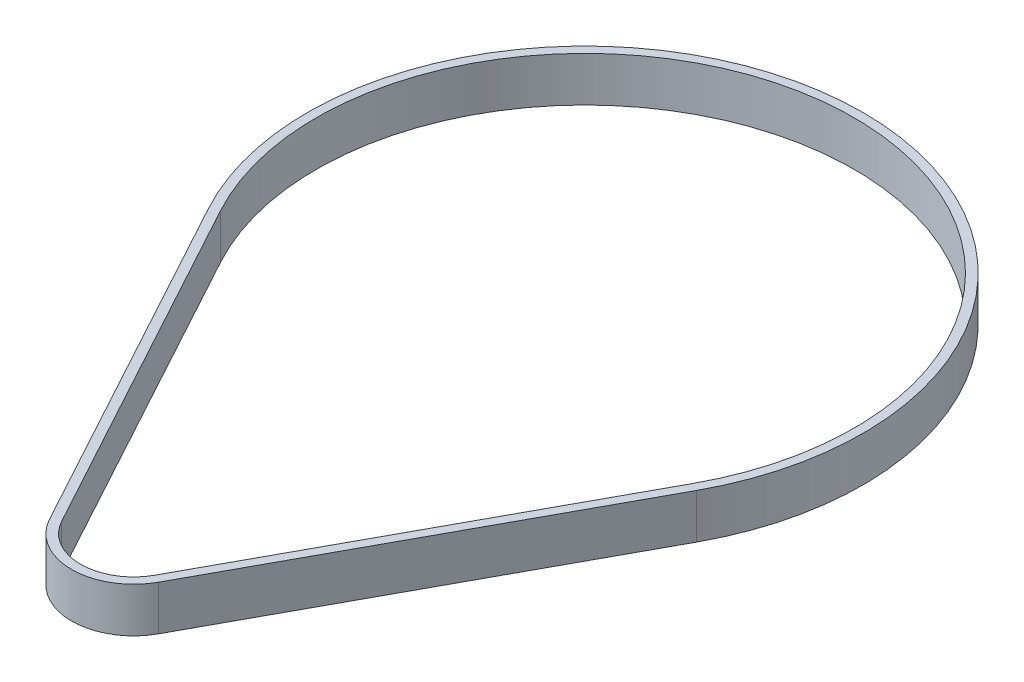
ISO-10303-21;
HEADER;
FILE_DESCRIPTION(('STEP AP214'),'2;1');
FILE_NAME('part.step','',(''),(''),'','','');
FILE_SCHEMA(('AUTOMOTIVE_DESIGN { 1 0 10303 214 1 1 1 1 }'));
ENDSEC;
DATA;
#1=APPLICATION_CONTEXT('core data for automotive mechanical design processes');
#2=APPLICATION_PROTOCOL_DEFINITION('international standard','automotive_design',2000,#1);
#3=PRODUCT_CONTEXT('',#1,'mechanical');
#4=PRODUCT('Part','Part','',(#3));
#5=PRODUCT_RELATED_PRODUCT_CATEGORY('part','',(#4));
#6=PRODUCT_DEFINITION_FORMATION('','',#4);
#7=PRODUCT_DEFINITION_CONTEXT('part definition',#1,'design');
#8=PRODUCT_DEFINITION('design','',#6,#7);
#9=PRODUCT_DEFINITION_SHAPE('','',#8);
#10=(LENGTH_UNIT() NAMED_UNIT(*) SI_UNIT(.MILLI.,.METRE.));
#11=(NAMED_UNIT(*) PLANE_ANGLE_UNIT() SI_UNIT($,.RADIAN.));
#12=(NAMED_UNIT(*) SI_UNIT($,.STERADIAN.) SOLID_ANGLE_UNIT());
#13=UNCERTAINTY_MEASURE_WITH_UNIT(LENGTH_MEASURE(1.E-05),#10,'distance_accuracy_value','');
#14=(GEOMETRIC_REPRESENTATION_CONTEXT(3) GLOBAL_UNCERTAINTY_ASSIGNED_CONTEXT((#13)) GLOBAL_UNIT_ASSIGNED_CONTEXT((#10,
#11,#12)) REPRESENTATION_CONTEXT('',''));
#15=CARTESIAN_POINT('',(0.,0.,0.));
#16=DIRECTION('',(0.,0.,1.));
#17=DIRECTION('',(1.,0.,0.));
#18=AXIS2_PLACEMENT_3D('',#15,#16,#17);
#19=CARTESIAN_POINT('',(12.1791391900727,10.,6.62622015849431));
#20=DIRECTION('',(-0.878408884967375,0.,-0.477909856364537));
#21=DIRECTION('',(-0.477909856364537,0.,0.878408884967375));
#22=AXIS2_PLACEMENT_3D('',#19,#20,#21);
#23=PLANE('',#22);
#24=DIRECTION('',(0.477909856364537,0.,-0.878408884967375));
#25=VECTOR('',#24,1.);
#26=CARTESIAN_POINT('',(12.1791391900727,0.,6.62622015849431));
#27=LINE('',#26,#25);
#28=CARTESIAN_POINT('',(12.1791391900727,0.,6.62622015849431));
#29=VERTEX_POINT('',#28);
#30=CARTESIAN_POINT('',(54.5579758453237,0.,-71.2670188211986));
#31=VERTEX_POINT('',#30);
#32=EDGE_CURVE('E145',#29,#31,#27,.T.);
#33=ORIENTED_EDGE('',*,*,#32,.T.);
#34=DIRECTION('',(0.,-1.,0.));
#35=VECTOR('',#34,1.);
#36=CARTESIAN_POINT('',(54.5579758453237,10.,-71.2670188211986));
#37=LINE('',#36,#35);
#38=CARTESIAN_POINT('',(54.5579758453237,10.,-71.2670188211986));
#39=VERTEX_POINT('',#38);
#40=EDGE_CURVE('E11',#39,#31,#37,.T.);
#41=ORIENTED_EDGE('',*,*,#40,.F.);
#42=DIRECTION('',(0.477909856364537,0.,-0.878408884967375));
#43=VECTOR('',#42,1.);
#44=CARTESIAN_POINT('',(12.1791391900727,10.,6.62622015849431));
#45=LINE('',#44,#43);
#46=CARTESIAN_POINT('',(12.1791391900727,10.,6.62622015849431));
#47=VERTEX_POINT('',#46);
#48=EDGE_CURVE('E116',#47,#39,#45,.T.);
#49=ORIENTED_EDGE('',*,*,#48,.F.);
#50=DIRECTION('',(0.,-1.,0.));
#51=VECTOR('',#50,1.);
#52=CARTESIAN_POINT('',(12.1791391900727,10.,6.62622015849431));
#53=LINE('',#52,#51);
#54=EDGE_CURVE('E153',#47,#29,#53,.T.);
#55=ORIENTED_EDGE('',*,*,#54,.T.);
#56=EDGE_LOOP('',(#33,#41,#49,#55));
#57=FACE_BOUND('',#56,.T.);
#58=ADVANCED_FACE('F39',(#57),#23,.F.);
#59=CARTESIAN_POINT('',(0.,10.,-100.95));
#60=DIRECTION('',(0.,-1.,0.));
#61=DIRECTION('',(0.,0.,-1.));
#62=AXIS2_PLACEMENT_3D('',#59,#60,#61);
#63=CYLINDRICAL_SURFACE('',#62,62.11);
#64=CARTESIAN_POINT('',(0.,0.,-100.95));
#65=DIRECTION('',(0.,1.,0.));
#66=DIRECTION('',(0.,0.,1.));
#67=AXIS2_PLACEMENT_3D('',#64,#65,#66);
#68=CIRCLE('',#67,62.11);
#69=CARTESIAN_POINT('',(-54.5579758453237,0.,-71.2670188211986));
#70=VERTEX_POINT('',#69);
#71=EDGE_CURVE('E122',#31,#70,#68,.T.);
#72=ORIENTED_EDGE('',*,*,#71,.T.);
#73=DIRECTION('',(0.,-1.,0.));
#74=VECTOR('',#73,1.);
#75=CARTESIAN_POINT('',(-54.5579758453237,10.,-71.2670188211986));
#76=LINE('',#75,#74);
#77=CARTESIAN_POINT('',(-54.5579758453237,10.,-71.2670188211986));
#78=VERTEX_POINT('',#77);
#79=EDGE_CURVE('E49',#78,#70,#76,.T.);
#80=ORIENTED_EDGE('',*,*,#79,.F.);
#81=CARTESIAN_POINT('',(0.,10.,-100.95));
#82=DIRECTION('',(0.,1.,0.));
#83=DIRECTION('',(0.,0.,1.));
#84=AXIS2_PLACEMENT_3D('',#81,#82,#83);
#85=CIRCLE('',#84,62.11);
#86=EDGE_CURVE('E110',#39,#78,#85,.T.);
#87=ORIENTED_EDGE('',*,*,#86,.F.);
#88=ORIENTED_EDGE('',*,*,#40,.T.);
#89=EDGE_LOOP('',(#72,#80,#87,#88));
#90=FACE_BOUND('',#89,.T.);
#91=ADVANCED_FACE('F121',(#90),#63,.T.);
#92=CARTESIAN_POINT('',(-12.1791391900727,10.,6.62622015849431));
#93=DIRECTION('',(-0.878408884967375,0.,0.477909856364537));
#94=DIRECTION('',(0.477909856364537,0.,0.878408884967375));
#95=AXIS2_PLACEMENT_3D('',#92,#93,#94);
#96=PLANE('',#95);
#97=DIRECTION('',(-0.477909856364537,0.,-0.878408884967375));
#98=VECTOR('',#97,1.);
#99=CARTESIAN_POINT('',(-12.1791391900727,0.,6.62622015849431));
#100=LINE('',#99,#98);
#101=CARTESIAN_POINT('',(-12.1791391900727,0.,6.6262201584943));
#102=VERTEX_POINT('',#101);
#103=EDGE_CURVE('E149',#102,#70,#100,.T.);
#104=ORIENTED_EDGE('',*,*,#103,.F.);
#105=DIRECTION('',(0.,-1.,0.));
#106=VECTOR('',#105,1.);
#107=CARTESIAN_POINT('',(-12.1791391900727,10.,6.6262201584943));
#108=LINE('',#107,#106);
#109=CARTESIAN_POINT('',(-12.1791391900727,10.,6.6262201584943));
#110=VERTEX_POINT('',#109);
#111=EDGE_CURVE('E86',#110,#102,#108,.T.);
#112=ORIENTED_EDGE('',*,*,#111,.F.);
#113=DIRECTION('',(-0.477909856364537,0.,-0.878408884967375));
#114=VECTOR('',#113,1.);
#115=CARTESIAN_POINT('',(-12.1791391900727,10.,6.62622015849431));
#116=LINE('',#115,#114);
#117=EDGE_CURVE('E114',#110,#78,#116,.T.);
#118=ORIENTED_EDGE('',*,*,#117,.T.);
#119=ORIENTED_EDGE('',*,*,#79,.T.);
#120=EDGE_LOOP('',(#104,#112,#118,#119));
#121=FACE_BOUND('',#120,.T.);
#122=ADVANCED_FACE('F127',(#121),#96,.T.);
#123=CARTESIAN_POINT('',(0.,10.,-100.95));
#124=DIRECTION('',(0.,-1.,0.));
#125=DIRECTION('',(0.,0.,-1.));
#126=AXIS2_PLACEMENT_3D('',#123,#124,#125);
#127=CYLINDRICAL_SURFACE('',#126,60.11);
#128=CARTESIAN_POINT('',(0.,0.,-100.95));
#129=DIRECTION('',(0.,1.,0.));
#130=DIRECTION('',(0.,0.,1.));
#131=AXIS2_PLACEMENT_3D('',#128,#129,#130);
#132=CIRCLE('',#131,60.11);
#133=CARTESIAN_POINT('',(52.801158075389,0.,-72.2228385339277));
#134=VERTEX_POINT('',#133);
#135=CARTESIAN_POINT('',(-52.8011580753889,0.,-72.2228385339277));
#136=VERTEX_POINT('',#135);
#137=EDGE_CURVE('E133',#134,#136,#132,.T.);
#138=ORIENTED_EDGE('',*,*,#137,.F.);
#139=DIRECTION('',(0.,-1.,0.));
#140=VECTOR('',#139,1.);
#141=CARTESIAN_POINT('',(52.801158075389,10.,-72.2228385339277));
#142=LINE('',#141,#140);
#143=CARTESIAN_POINT('',(52.801158075389,10.,-72.2228385339277));
#144=VERTEX_POINT('',#143);
#145=EDGE_CURVE('E43',#144,#134,#142,.T.);
#146=ORIENTED_EDGE('',*,*,#145,.F.);
#147=CARTESIAN_POINT('',(0.,10.,-100.95));
#148=DIRECTION('',(0.,1.,0.));
#149=DIRECTION('',(0.,0.,1.));
#150=AXIS2_PLACEMENT_3D('',#147,#148,#149);
#151=CIRCLE('',#150,60.11);
#152=CARTESIAN_POINT('',(-52.8011580753889,10.,-72.2228385339277));
#153=VERTEX_POINT('',#152);
#154=EDGE_CURVE('E152',#144,#153,#151,.T.);
#155=ORIENTED_EDGE('',*,*,#154,.T.);
#156=DIRECTION('',(0.,-1.,0.));
#157=VECTOR('',#156,1.);
#158=CARTESIAN_POINT('',(-52.8011580753889,10.,-72.2228385339277));
#159=LINE('',#158,#157);
#160=EDGE_CURVE('E129',#153,#136,#159,.T.);
#161=ORIENTED_EDGE('',*,*,#160,.T.);
#162=EDGE_LOOP('',(#138,#146,#155,#161));
#163=FACE_BOUND('',#162,.T.);
#164=ADVANCED_FACE('F41',(#163),#127,.F.);
#165=CARTESIAN_POINT('',(10.4223214201379,10.,5.67040044576523));
#166=DIRECTION('',(-0.878408884967375,0.,-0.477909856364537));
#167=DIRECTION('',(-0.477909856364537,0.,0.878408884967375));
#168=AXIS2_PLACEMENT_3D('',#165,#166,#167);
#169=PLANE('',#168);
#170=DIRECTION('',(0.477909856364537,0.,-0.878408884967375));
#171=VECTOR('',#170,1.);
#172=CARTESIAN_POINT('',(10.4223214201379,0.,5.67040044576523));
#173=LINE('',#172,#171);
#174=CARTESIAN_POINT('',(10.4223214201379,0.,5.67040044576523));
#175=VERTEX_POINT('',#174);
#176=EDGE_CURVE('E136',#175,#134,#173,.T.);
#177=ORIENTED_EDGE('',*,*,#176,.F.);
#178=DIRECTION('',(0.,-1.,0.));
#179=VECTOR('',#178,1.);
#180=CARTESIAN_POINT('',(10.4223214201379,10.,5.67040044576523));
#181=LINE('',#180,#179);
#182=CARTESIAN_POINT('',(10.4223214201379,10.,5.67040044576523));
#183=VERTEX_POINT('',#182);
#184=EDGE_CURVE('E158',#183,#175,#181,.T.);
#185=ORIENTED_EDGE('',*,*,#184,.F.);
#186=DIRECTION('',(0.477909856364537,0.,-0.878408884967375));
#187=VECTOR('',#186,1.);
#188=CARTESIAN_POINT('',(10.4223214201379,10.,5.67040044576523));
#189=LINE('',#188,#187);
#190=EDGE_CURVE('E167',#183,#144,#189,.T.);
#191=ORIENTED_EDGE('',*,*,#190,.T.);
#192=ORIENTED_EDGE('',*,*,#145,.T.);
#193=EDGE_LOOP('',(#177,#185,#191,#192));
#194=FACE_BOUND('',#193,.T.);
#195=ADVANCED_FACE('F165',(#194),#169,.T.);
#196=CARTESIAN_POINT('',(0.,10.,0.));
#197=DIRECTION('',(0.,-1.,0.));
#198=DIRECTION('',(0.,0.,-1.));
#199=AXIS2_PLACEMENT_3D('',#196,#197,#198);
#200=CYLINDRICAL_SURFACE('',#199,11.865);
#201=CARTESIAN_POINT('',(0.,0.,0.));
#202=DIRECTION('',(0.,1.,0.));
#203=DIRECTION('',(0.,0.,1.));
#204=AXIS2_PLACEMENT_3D('',#201,#202,#203);
#205=CIRCLE('',#204,11.865);
#206=CARTESIAN_POINT('',(-10.4223214201379,0.,5.67040044576523));
#207=VERTEX_POINT('',#206);
#208=EDGE_CURVE('E139',#207,#175,#205,.T.);
#209=ORIENTED_EDGE('',*,*,#208,.F.);
#210=DIRECTION('',(0.,-1.,0.));
#211=VECTOR('',#210,1.);
#212=CARTESIAN_POINT('',(-10.4223214201379,10.,5.67040044576523));
#213=LINE('',#212,#211);
#214=CARTESIAN_POINT('',(-10.4223214201379,10.,5.67040044576523));
#215=VERTEX_POINT('',#214);
#216=EDGE_CURVE('E157',#215,#207,#213,.T.);
#217=ORIENTED_EDGE('',*,*,#216,.F.);
#218=CARTESIAN_POINT('',(0.,10.,0.));
#219=DIRECTION('',(0.,1.,0.));
#220=DIRECTION('',(0.,0.,1.));
#221=AXIS2_PLACEMENT_3D('',#218,#219,#220);
#222=CIRCLE('',#221,11.865);
#223=EDGE_CURVE('E176',#215,#183,#222,.T.);
#224=ORIENTED_EDGE('',*,*,#223,.T.);
#225=ORIENTED_EDGE('',*,*,#184,.T.);
#226=EDGE_LOOP('',(#209,#217,#224,#225));
#227=FACE_BOUND('',#226,.T.);
#228=ADVANCED_FACE('F173',(#227),#200,.F.);
#229=CARTESIAN_POINT('',(-10.4223214201379,10.,5.67040044576523));
#230=DIRECTION('',(-0.878408884967375,0.,0.477909856364537));
#231=DIRECTION('',(0.477909856364537,0.,0.878408884967375));
#232=AXIS2_PLACEMENT_3D('',#229,#230,#231);
#233=PLANE('',#232);
#234=DIRECTION('',(-0.477909856364537,0.,-0.878408884967375));
#235=VECTOR('',#234,1.);
#236=CARTESIAN_POINT('',(-10.4223214201379,0.,5.67040044576523));
#237=LINE('',#236,#235);
#238=EDGE_CURVE('E142',#207,#136,#237,.T.);
#239=ORIENTED_EDGE('',*,*,#238,.T.);
#240=ORIENTED_EDGE('',*,*,#160,.F.);
#241=DIRECTION('',(-0.477909856364537,0.,-0.878408884967375));
#242=VECTOR('',#241,1.);
#243=CARTESIAN_POINT('',(-10.4223214201379,10.,5.67040044576523));
#244=LINE('',#243,#242);
#245=EDGE_CURVE('E178',#215,#153,#244,.T.);
#246=ORIENTED_EDGE('',*,*,#245,.F.);
#247=ORIENTED_EDGE('',*,*,#216,.T.);
#248=EDGE_LOOP('',(#239,#240,#246,#247));
#249=FACE_BOUND('',#248,.T.);
#250=ADVANCED_FACE('F179',(#249),#233,.F.);
#251=CARTESIAN_POINT('',(0.,10.,0.));
#252=DIRECTION('',(0.,-1.,0.));
#253=DIRECTION('',(0.,0.,-1.));
#254=AXIS2_PLACEMENT_3D('',#251,#252,#253);
#255=CYLINDRICAL_SURFACE('',#254,13.865);
#256=CARTESIAN_POINT('',(0.,0.,0.));
#257=DIRECTION('',(0.,1.,0.));
#258=DIRECTION('',(0.,0.,1.));
#259=AXIS2_PLACEMENT_3D('',#256,#257,#258);
#260=CIRCLE('',#259,13.865);
#261=EDGE_CURVE('E89',#102,#29,#260,.T.);
#262=ORIENTED_EDGE('',*,*,#261,.T.);
#263=ORIENTED_EDGE('',*,*,#54,.F.);
#264=CARTESIAN_POINT('',(0.,10.,0.));
#265=DIRECTION('',(0.,1.,0.));
#266=DIRECTION('',(0.,0.,1.));
#267=AXIS2_PLACEMENT_3D('',#264,#265,#266);
#268=CIRCLE('',#267,13.865);
#269=EDGE_CURVE('E58',#110,#47,#268,.T.);
#270=ORIENTED_EDGE('',*,*,#269,.F.);
#271=ORIENTED_EDGE('',*,*,#111,.T.);
#272=EDGE_LOOP('',(#262,#263,#270,#271));
#273=FACE_BOUND('',#272,.T.);
#274=ADVANCED_FACE('F186',(#273),#255,.T.);
#275=CARTESIAN_POINT('',(0.,10.,0.));
#276=DIRECTION('',(0.,1.,0.));
#277=DIRECTION('',(0.,0.,1.));
#278=AXIS2_PLACEMENT_3D('',#275,#276,#277);
#279=PLANE('',#278);
#280=ORIENTED_EDGE('',*,*,#154,.F.);
#281=ORIENTED_EDGE('',*,*,#190,.F.);
#282=ORIENTED_EDGE('',*,*,#223,.F.);
#283=ORIENTED_EDGE('',*,*,#245,.T.);
#284=EDGE_LOOP('',(#280,#281,#282,#283));
#285=FACE_BOUND('',#284,.T.);
#286=ORIENTED_EDGE('',*,*,#48,.T.);
#287=ORIENTED_EDGE('',*,*,#86,.T.);
#288=ORIENTED_EDGE('',*,*,#117,.F.);
#289=ORIENTED_EDGE('',*,*,#269,.T.);
#290=EDGE_LOOP('',(#286,#287,#288,#289));
#291=FACE_BOUND('',#290,.T.);
#292=ADVANCED_FACE('F112',(#285,#291),#279,.T.);
#293=CARTESIAN_POINT('',(0.,0.,0.));
#294=DIRECTION('',(0.,1.,0.));
#295=DIRECTION('',(0.,0.,1.));
#296=AXIS2_PLACEMENT_3D('',#293,#294,#295);
#297=PLANE('',#296);
#298=ORIENTED_EDGE('',*,*,#137,.T.);
#299=ORIENTED_EDGE('',*,*,#238,.F.);
#300=ORIENTED_EDGE('',*,*,#208,.T.);
#301=ORIENTED_EDGE('',*,*,#176,.T.);
#302=EDGE_LOOP('',(#298,#299,#300,#301));
#303=FACE_BOUND('',#302,.T.);
#304=ORIENTED_EDGE('',*,*,#32,.F.);
#305=ORIENTED_EDGE('',*,*,#261,.F.);
#306=ORIENTED_EDGE('',*,*,#103,.T.);
#307=ORIENTED_EDGE('',*,*,#71,.F.);
#308=EDGE_LOOP('',(#304,#305,#306,#307));
#309=FACE_BOUND('',#308,.T.);
#310=ADVANCED_FACE('F171',(#303,#309),#297,.F.);
#311=CLOSED_SHELL('',(#58,#91,#122,#164,#195,#228,#250,#274,#292,#310));
#312=MANIFOLD_SOLID_BREP('B2',#311);
#313=ADVANCED_BREP_SHAPE_REPRESENTATION('',(#18,#312),#14);
#314=SHAPE_DEFINITION_REPRESENTATION(#9,#313);
ENDSEC;
END-ISO-10303-21;
